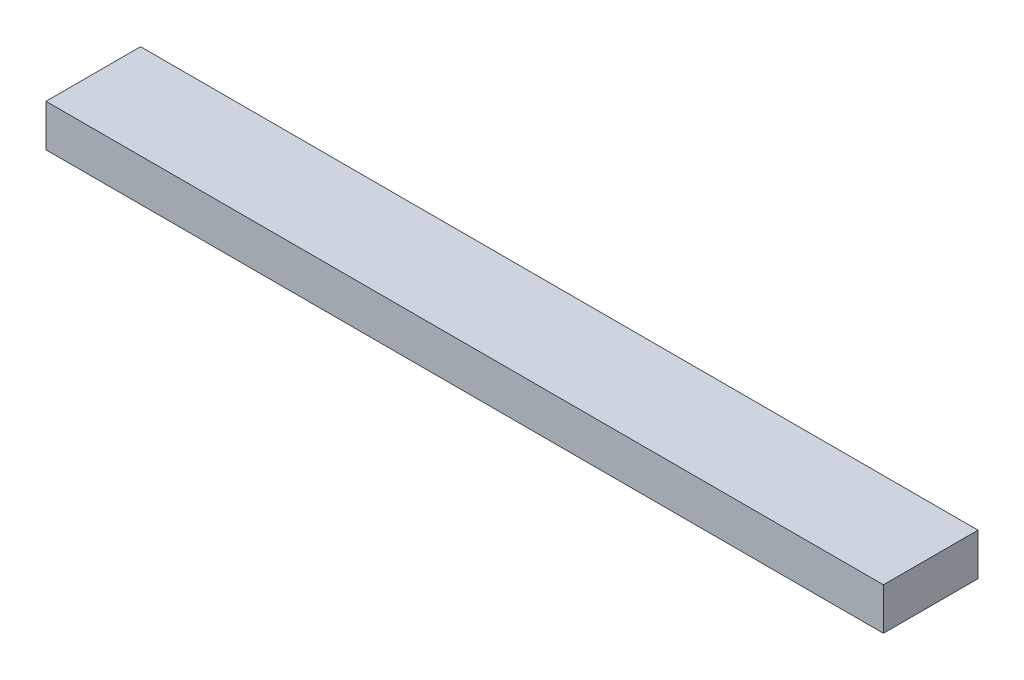
ISO-10303-21;
HEADER;
FILE_DESCRIPTION(('STEP AP214'),'2;1');
FILE_NAME('part.step','',(''),(''),'','','');
FILE_SCHEMA(('AUTOMOTIVE_DESIGN { 1 0 10303 214 1 1 1 1 }'));
ENDSEC;
DATA;
#1=APPLICATION_CONTEXT('core data for automotive mechanical design processes');
#2=APPLICATION_PROTOCOL_DEFINITION('international standard','automotive_design',2000,#1);
#3=PRODUCT_CONTEXT('',#1,'mechanical');
#4=PRODUCT('Part','Part','',(#3));
#5=PRODUCT_RELATED_PRODUCT_CATEGORY('part','',(#4));
#6=PRODUCT_DEFINITION_FORMATION('','',#4);
#7=PRODUCT_DEFINITION_CONTEXT('part definition',#1,'design');
#8=PRODUCT_DEFINITION('design','',#6,#7);
#9=PRODUCT_DEFINITION_SHAPE('','',#8);
#10=(LENGTH_UNIT() NAMED_UNIT(*) SI_UNIT(.MILLI.,.METRE.));
#11=(NAMED_UNIT(*) PLANE_ANGLE_UNIT() SI_UNIT($,.RADIAN.));
#12=(NAMED_UNIT(*) SI_UNIT($,.STERADIAN.) SOLID_ANGLE_UNIT());
#13=UNCERTAINTY_MEASURE_WITH_UNIT(LENGTH_MEASURE(1.E-05),#10,'distance_accuracy_value','');
#14=(GEOMETRIC_REPRESENTATION_CONTEXT(3) GLOBAL_UNCERTAINTY_ASSIGNED_CONTEXT((#13)) GLOBAL_UNIT_ASSIGNED_CONTEXT((#10,
#11,#12)) REPRESENTATION_CONTEXT('',''));
#15=CARTESIAN_POINT('',(0.,0.,0.));
#16=DIRECTION('',(0.,0.,1.));
#17=DIRECTION('',(1.,0.,0.));
#18=AXIS2_PLACEMENT_3D('',#15,#16,#17);
#19=CARTESIAN_POINT('',(-126.488766336441,-311.15,281.871115322085));
#20=DIRECTION('',(1.,0.,0.));
#21=DIRECTION('',(0.,0.,-1.));
#22=AXIS2_PLACEMENT_3D('',#19,#20,#21);
#23=PLANE('',#22);
#24=DIRECTION('',(0.,-1.,0.));
#25=VECTOR('',#24,1.);
#26=CARTESIAN_POINT('',(-126.488766336441,-311.15,28.575));
#27=LINE('',#26,#25);
#28=CARTESIAN_POINT('',(-126.488766336441,-298.45,28.575));
#29=VERTEX_POINT('',#28);
#30=CARTESIAN_POINT('',(-126.488766336441,-311.15,28.575));
#31=VERTEX_POINT('',#30);
#32=EDGE_CURVE('E85',#29,#31,#27,.T.);
#33=ORIENTED_EDGE('',*,*,#32,.F.);
#34=DIRECTION('',(0.,0.,-1.));
#35=VECTOR('',#34,1.);
#36=CARTESIAN_POINT('',(-126.488766336441,-298.45,281.871115322085));
#37=LINE('',#36,#35);
#38=CARTESIAN_POINT('',(-126.488766336441,-298.45,0.));
#39=VERTEX_POINT('',#38);
#40=EDGE_CURVE('E39',#29,#39,#37,.T.);
#41=ORIENTED_EDGE('',*,*,#40,.T.);
#42=DIRECTION('',(0.,-1.,0.));
#43=VECTOR('',#42,1.);
#44=CARTESIAN_POINT('',(-126.488766336441,-311.15,0.));
#45=LINE('',#44,#43);
#46=CARTESIAN_POINT('',(-126.488766336441,-311.15,0.));
#47=VERTEX_POINT('',#46);
#48=EDGE_CURVE('E83',#39,#47,#45,.T.);
#49=ORIENTED_EDGE('',*,*,#48,.T.);
#50=DIRECTION('',(0.,0.,-1.));
#51=VECTOR('',#50,1.);
#52=CARTESIAN_POINT('',(-126.488766336441,-311.15,281.871115322085));
#53=LINE('',#52,#51);
#54=EDGE_CURVE('E74',#31,#47,#53,.T.);
#55=ORIENTED_EDGE('',*,*,#54,.F.);
#56=EDGE_LOOP('',(#33,#41,#49,#55));
#57=FACE_BOUND('',#56,.T.);
#58=ADVANCED_FACE('F35',(#57),#23,.F.);
#59=CARTESIAN_POINT('',(-126.488766336441,-311.15,281.871115322085));
#60=DIRECTION('',(0.,1.,0.));
#61=DIRECTION('',(0.,0.,1.));
#62=AXIS2_PLACEMENT_3D('',#59,#60,#61);
#63=PLANE('',#62);
#64=DIRECTION('',(1.,0.,0.));
#65=VECTOR('',#64,1.);
#66=CARTESIAN_POINT('',(-126.488766336441,-311.15,28.575));
#67=LINE('',#66,#65);
#68=CARTESIAN_POINT('',(126.488766336441,-311.15,28.575));
#69=VERTEX_POINT('',#68);
#70=EDGE_CURVE('E44',#31,#69,#67,.T.);
#71=ORIENTED_EDGE('',*,*,#70,.F.);
#72=ORIENTED_EDGE('',*,*,#54,.T.);
#73=DIRECTION('',(1.,0.,0.));
#74=VECTOR('',#73,1.);
#75=CARTESIAN_POINT('',(-126.488766336441,-311.15,0.));
#76=LINE('',#75,#74);
#77=CARTESIAN_POINT('',(126.488766336441,-311.15,0.));
#78=VERTEX_POINT('',#77);
#79=EDGE_CURVE('E95',#47,#78,#76,.T.);
#80=ORIENTED_EDGE('',*,*,#79,.T.);
#81=DIRECTION('',(0.,0.,-1.));
#82=VECTOR('',#81,1.);
#83=CARTESIAN_POINT('',(126.488766336441,-311.15,281.871115322085));
#84=LINE('',#83,#82);
#85=EDGE_CURVE('E104',#69,#78,#84,.T.);
#86=ORIENTED_EDGE('',*,*,#85,.F.);
#87=EDGE_LOOP('',(#71,#72,#80,#86));
#88=FACE_BOUND('',#87,.T.);
#89=ADVANCED_FACE('F108',(#88),#63,.F.);
#90=CARTESIAN_POINT('',(126.488766336441,-311.15,281.871115322085));
#91=DIRECTION('',(-1.,0.,0.));
#92=DIRECTION('',(0.,0.,1.));
#93=AXIS2_PLACEMENT_3D('',#90,#91,#92);
#94=PLANE('',#93);
#95=DIRECTION('',(0.,1.,0.));
#96=VECTOR('',#95,1.);
#97=CARTESIAN_POINT('',(126.488766336441,-311.15,28.575));
#98=LINE('',#97,#96);
#99=CARTESIAN_POINT('',(126.488766336441,-298.45,28.575));
#100=VERTEX_POINT('',#99);
#101=EDGE_CURVE('E11',#69,#100,#98,.T.);
#102=ORIENTED_EDGE('',*,*,#101,.F.);
#103=ORIENTED_EDGE('',*,*,#85,.T.);
#104=DIRECTION('',(0.,1.,0.));
#105=VECTOR('',#104,1.);
#106=CARTESIAN_POINT('',(126.488766336441,-311.15,0.));
#107=LINE('',#106,#105);
#108=CARTESIAN_POINT('',(126.488766336441,-298.45,0.));
#109=VERTEX_POINT('',#108);
#110=EDGE_CURVE('E105',#78,#109,#107,.T.);
#111=ORIENTED_EDGE('',*,*,#110,.T.);
#112=DIRECTION('',(0.,0.,-1.));
#113=VECTOR('',#112,1.);
#114=CARTESIAN_POINT('',(126.488766336441,-298.45,281.871115322085));
#115=LINE('',#114,#113);
#116=EDGE_CURVE('E57',#100,#109,#115,.T.);
#117=ORIENTED_EDGE('',*,*,#116,.F.);
#118=EDGE_LOOP('',(#102,#103,#111,#117));
#119=FACE_BOUND('',#118,.T.);
#120=ADVANCED_FACE('F107',(#119),#94,.F.);
#121=CARTESIAN_POINT('',(-126.488766336441,-298.45,281.871115322085));
#122=DIRECTION('',(0.,-1.,0.));
#123=DIRECTION('',(0.,0.,-1.));
#124=AXIS2_PLACEMENT_3D('',#121,#122,#123);
#125=PLANE('',#124);
#126=DIRECTION('',(-1.,0.,0.));
#127=VECTOR('',#126,1.);
#128=CARTESIAN_POINT('',(-126.488766336441,-298.45,28.575));
#129=LINE('',#128,#127);
#130=EDGE_CURVE('E92',#100,#29,#129,.T.);
#131=ORIENTED_EDGE('',*,*,#130,.F.);
#132=ORIENTED_EDGE('',*,*,#116,.T.);
#133=DIRECTION('',(-1.,0.,0.));
#134=VECTOR('',#133,1.);
#135=CARTESIAN_POINT('',(-126.488766336441,-298.45,0.));
#136=LINE('',#135,#134);
#137=EDGE_CURVE('E88',#109,#39,#136,.T.);
#138=ORIENTED_EDGE('',*,*,#137,.T.);
#139=ORIENTED_EDGE('',*,*,#40,.F.);
#140=EDGE_LOOP('',(#131,#132,#138,#139));
#141=FACE_BOUND('',#140,.T.);
#142=ADVANCED_FACE('F89',(#141),#125,.F.);
#143=CARTESIAN_POINT('',(0.,0.,0.));
#144=DIRECTION('',(0.,0.,-1.));
#145=DIRECTION('',(-1.,0.,0.));
#146=AXIS2_PLACEMENT_3D('',#143,#144,#145);
#147=PLANE('',#146);
#148=ORIENTED_EDGE('',*,*,#48,.F.);
#149=ORIENTED_EDGE('',*,*,#137,.F.);
#150=ORIENTED_EDGE('',*,*,#110,.F.);
#151=ORIENTED_EDGE('',*,*,#79,.F.);
#152=EDGE_LOOP('',(#148,#149,#150,#151));
#153=FACE_BOUND('',#152,.T.);
#154=ADVANCED_FACE('F94',(#153),#147,.T.);
#155=CARTESIAN_POINT('',(0.,0.,28.575));
#156=DIRECTION('',(0.,0.,1.));
#157=DIRECTION('',(1.,0.,0.));
#158=AXIS2_PLACEMENT_3D('',#155,#156,#157);
#159=PLANE('',#158);
#160=ORIENTED_EDGE('',*,*,#130,.T.);
#161=ORIENTED_EDGE('',*,*,#32,.T.);
#162=ORIENTED_EDGE('',*,*,#70,.T.);
#163=ORIENTED_EDGE('',*,*,#101,.T.);
#164=EDGE_LOOP('',(#160,#161,#162,#163));
#165=FACE_BOUND('',#164,.T.);
#166=ADVANCED_FACE('F37',(#165),#159,.T.);
#167=CLOSED_SHELL('',(#58,#89,#120,#142,#154,#166));
#168=MANIFOLD_SOLID_BREP('B2',#167);
#169=ADVANCED_BREP_SHAPE_REPRESENTATION('',(#18,#168),#14);
#170=SHAPE_DEFINITION_REPRESENTATION(#9,#169);
ENDSEC;
END-ISO-10303-21;
